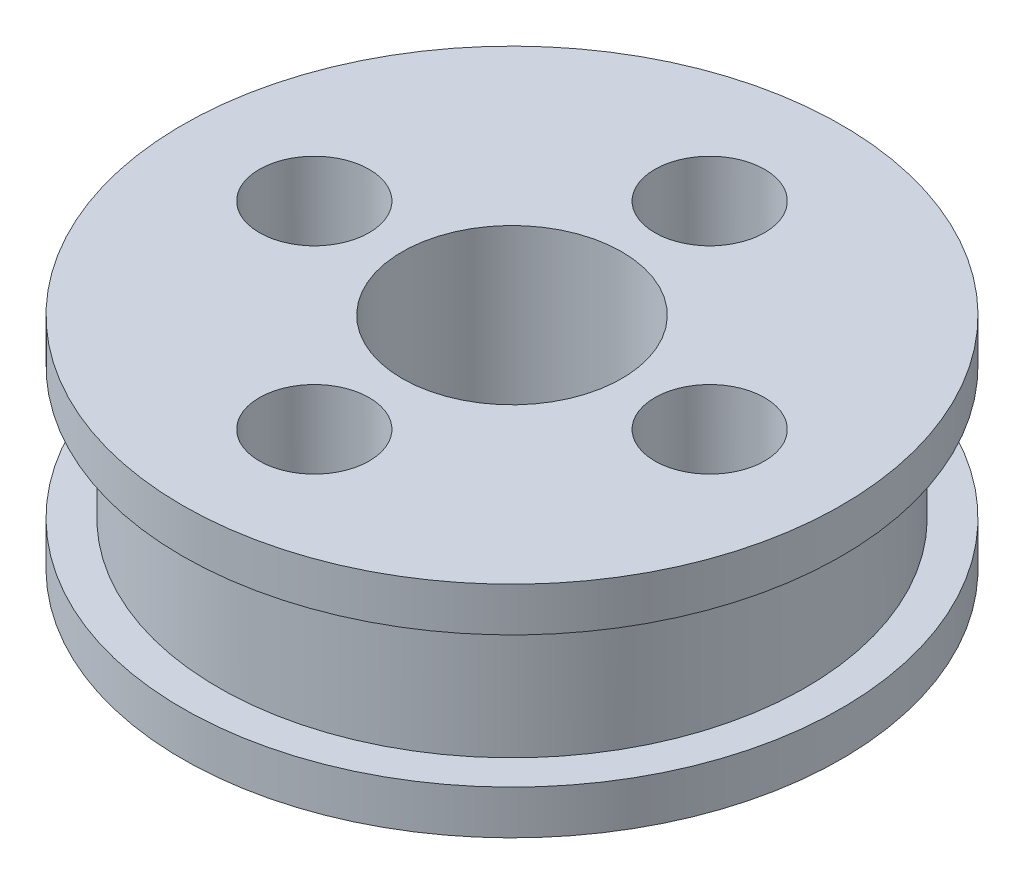
ISO-10303-21;
HEADER;
FILE_DESCRIPTION(('STEP AP214'),'2;1');
FILE_NAME('part.step','',(''),(''),'','','');
FILE_SCHEMA(('AUTOMOTIVE_DESIGN { 1 0 10303 214 1 1 1 1 }'));
ENDSEC;
DATA;
#1=APPLICATION_CONTEXT('core data for automotive mechanical design processes');
#2=APPLICATION_PROTOCOL_DEFINITION('international standard','automotive_design',2000,#1);
#3=PRODUCT_CONTEXT('',#1,'mechanical');
#4=PRODUCT('Part','Part','',(#3));
#5=PRODUCT_RELATED_PRODUCT_CATEGORY('part','',(#4));
#6=PRODUCT_DEFINITION_FORMATION('','',#4);
#7=PRODUCT_DEFINITION_CONTEXT('part definition',#1,'design');
#8=PRODUCT_DEFINITION('design','',#6,#7);
#9=PRODUCT_DEFINITION_SHAPE('','',#8);
#10=(LENGTH_UNIT() NAMED_UNIT(*) SI_UNIT(.MILLI.,.METRE.));
#11=(NAMED_UNIT(*) PLANE_ANGLE_UNIT() SI_UNIT($,.RADIAN.));
#12=(NAMED_UNIT(*) SI_UNIT($,.STERADIAN.) SOLID_ANGLE_UNIT());
#13=UNCERTAINTY_MEASURE_WITH_UNIT(LENGTH_MEASURE(1.E-05),#10,'distance_accuracy_value','');
#14=(GEOMETRIC_REPRESENTATION_CONTEXT(3) GLOBAL_UNCERTAINTY_ASSIGNED_CONTEXT((#13)) GLOBAL_UNIT_ASSIGNED_CONTEXT((#10,
#11,#12)) REPRESENTATION_CONTEXT('',''));
#15=CARTESIAN_POINT('',(0.,0.,0.));
#16=DIRECTION('',(0.,0.,1.));
#17=DIRECTION('',(1.,0.,0.));
#18=AXIS2_PLACEMENT_3D('',#15,#16,#17);
#19=CARTESIAN_POINT('',(0.,10.,0.));
#20=DIRECTION('',(0.,-1.,0.));
#21=DIRECTION('',(0.,0.,-1.));
#22=AXIS2_PLACEMENT_3D('',#19,#20,#21);
#23=CYLINDRICAL_SURFACE('',#22,13.365);
#24=CARTESIAN_POINT('',(0.,8.,0.));
#25=DIRECTION('',(0.,1.,0.));
#26=DIRECTION('',(0.,0.,1.));
#27=AXIS2_PLACEMENT_3D('',#24,#25,#26);
#28=CIRCLE('',#27,13.365);
#29=CARTESIAN_POINT('',(0.,8.,13.365));
#30=VERTEX_POINT('',#29);
#31=EDGE_CURVE('E39',#30,#30,#28,.T.);
#32=ORIENTED_EDGE('',*,*,#31,.F.);
#33=EDGE_LOOP('',(#32));
#34=FACE_BOUND('',#33,.T.);
#35=CARTESIAN_POINT('',(0.,2.,0.));
#36=DIRECTION('',(0.,-1.,0.));
#37=DIRECTION('',(0.,0.,-1.));
#38=AXIS2_PLACEMENT_3D('',#35,#36,#37);
#39=CIRCLE('',#38,13.365);
#40=CARTESIAN_POINT('',(0.,2.,-13.365));
#41=VERTEX_POINT('',#40);
#42=EDGE_CURVE('E10',#41,#41,#39,.T.);
#43=ORIENTED_EDGE('',*,*,#42,.F.);
#44=EDGE_LOOP('',(#43));
#45=FACE_BOUND('',#44,.T.);
#46=ADVANCED_FACE('F32',(#34,#45),#23,.T.);
#47=CARTESIAN_POINT('',(0.,8.,0.));
#48=DIRECTION('',(0.,1.,0.));
#49=DIRECTION('',(0.,0.,1.));
#50=AXIS2_PLACEMENT_3D('',#47,#48,#49);
#51=CYLINDRICAL_SURFACE('',#50,15.);
#52=CARTESIAN_POINT('',(0.,8.,0.));
#53=DIRECTION('',(0.,1.,0.));
#54=DIRECTION('',(0.,0.,1.));
#55=AXIS2_PLACEMENT_3D('',#52,#53,#54);
#56=CIRCLE('',#55,15.);
#57=CARTESIAN_POINT('',(0.,8.,15.));
#58=VERTEX_POINT('',#57);
#59=EDGE_CURVE('E44',#58,#58,#56,.T.);
#60=ORIENTED_EDGE('',*,*,#59,.T.);
#61=EDGE_LOOP('',(#60));
#62=FACE_BOUND('',#61,.T.);
#63=CARTESIAN_POINT('',(0.,10.,0.));
#64=DIRECTION('',(0.,1.,0.));
#65=DIRECTION('',(0.,0.,1.));
#66=AXIS2_PLACEMENT_3D('',#63,#64,#65);
#67=CIRCLE('',#66,15.);
#68=CARTESIAN_POINT('',(0.,10.,15.));
#69=VERTEX_POINT('',#68);
#70=EDGE_CURVE('E71',#69,#69,#67,.T.);
#71=ORIENTED_EDGE('',*,*,#70,.F.);
#72=EDGE_LOOP('',(#71));
#73=FACE_BOUND('',#72,.T.);
#74=ADVANCED_FACE('F81',(#62,#73),#51,.T.);
#75=CARTESIAN_POINT('',(0.,8.,0.));
#76=DIRECTION('',(0.,1.,0.));
#77=DIRECTION('',(0.,0.,1.));
#78=AXIS2_PLACEMENT_3D('',#75,#76,#77);
#79=PLANE('',#78);
#80=ORIENTED_EDGE('',*,*,#31,.T.);
#81=EDGE_LOOP('',(#80));
#82=FACE_BOUND('',#81,.T.);
#83=ORIENTED_EDGE('',*,*,#59,.F.);
#84=EDGE_LOOP('',(#83));
#85=FACE_BOUND('',#84,.T.);
#86=ADVANCED_FACE('F83',(#82,#85),#79,.F.);
#87=CARTESIAN_POINT('',(0.,10.,0.));
#88=DIRECTION('',(0.,1.,0.));
#89=DIRECTION('',(0.,0.,1.));
#90=AXIS2_PLACEMENT_3D('',#87,#88,#89);
#91=PLANE('',#90);
#92=CARTESIAN_POINT('',(0.,10.,9.));
#93=DIRECTION('',(0.,-1.,0.));
#94=DIRECTION('',(0.,0.,-1.));
#95=AXIS2_PLACEMENT_3D('',#92,#93,#94);
#96=CIRCLE('',#95,2.5);
#97=CARTESIAN_POINT('',(0.,10.,6.5));
#98=VERTEX_POINT('',#97);
#99=EDGE_CURVE('E52',#98,#98,#96,.T.);
#100=ORIENTED_EDGE('',*,*,#99,.T.);
#101=EDGE_LOOP('',(#100));
#102=FACE_BOUND('',#101,.T.);
#103=CARTESIAN_POINT('',(0.,10.,0.));
#104=DIRECTION('',(0.,-1.,0.));
#105=DIRECTION('',(0.,0.,-1.));
#106=AXIS2_PLACEMENT_3D('',#103,#104,#105);
#107=CIRCLE('',#106,5.);
#108=CARTESIAN_POINT('',(0.,10.,-5.));
#109=VERTEX_POINT('',#108);
#110=EDGE_CURVE('E207',#109,#109,#107,.T.);
#111=ORIENTED_EDGE('',*,*,#110,.T.);
#112=EDGE_LOOP('',(#111));
#113=FACE_BOUND('',#112,.T.);
#114=CARTESIAN_POINT('',(9.00000000000025,10.,2.54142111694787E-13));
#115=DIRECTION('',(0.,-1.,0.));
#116=DIRECTION('',(0.,0.,-1.));
#117=AXIS2_PLACEMENT_3D('',#114,#115,#116);
#118=CIRCLE('',#117,2.5000000000002);
#119=CARTESIAN_POINT('',(9.00000000000025,10.,-2.49999999999995));
#120=VERTEX_POINT('',#119);
#121=EDGE_CURVE('E204',#120,#120,#118,.T.);
#122=ORIENTED_EDGE('',*,*,#121,.T.);
#123=EDGE_LOOP('',(#122));
#124=FACE_BOUND('',#123,.T.);
#125=CARTESIAN_POINT('',(5.08284223389574E-13,10.,-9.));
#126=DIRECTION('',(0.,-1.,0.));
#127=DIRECTION('',(0.,0.,-1.));
#128=AXIS2_PLACEMENT_3D('',#125,#126,#127);
#129=CIRCLE('',#128,2.50000000000055);
#130=CARTESIAN_POINT('',(5.08284223389574E-13,10.,-11.5000000000005));
#131=VERTEX_POINT('',#130);
#132=EDGE_CURVE('E201',#131,#131,#129,.T.);
#133=ORIENTED_EDGE('',*,*,#132,.T.);
#134=EDGE_LOOP('',(#133));
#135=FACE_BOUND('',#134,.T.);
#136=CARTESIAN_POINT('',(-8.99999999999975,10.,-2.5524429381402E-13));
#137=DIRECTION('',(0.,-1.,0.));
#138=DIRECTION('',(0.,0.,-1.));
#139=AXIS2_PLACEMENT_3D('',#136,#137,#138);
#140=CIRCLE('',#139,2.50000000000041);
#141=CARTESIAN_POINT('',(-8.99999999999975,10.,-2.50000000000066));
#142=VERTEX_POINT('',#141);
#143=EDGE_CURVE('E198',#142,#142,#140,.T.);
#144=ORIENTED_EDGE('',*,*,#143,.T.);
#145=EDGE_LOOP('',(#144));
#146=FACE_BOUND('',#145,.T.);
#147=ORIENTED_EDGE('',*,*,#70,.T.);
#148=EDGE_LOOP('',(#147));
#149=FACE_BOUND('',#148,.T.);
#150=ADVANCED_FACE('F79',(#102,#113,#124,#135,#146,#149),#91,.T.);
#151=CARTESIAN_POINT('',(0.,2.,0.));
#152=DIRECTION('',(0.,-1.,0.));
#153=DIRECTION('',(0.,0.,-1.));
#154=AXIS2_PLACEMENT_3D('',#151,#152,#153);
#155=CYLINDRICAL_SURFACE('',#154,15.);
#156=CARTESIAN_POINT('',(0.,2.,0.));
#157=DIRECTION('',(0.,-1.,0.));
#158=DIRECTION('',(0.,0.,-1.));
#159=AXIS2_PLACEMENT_3D('',#156,#157,#158);
#160=CIRCLE('',#159,15.);
#161=CARTESIAN_POINT('',(0.,2.,-15.));
#162=VERTEX_POINT('',#161);
#163=EDGE_CURVE('E66',#162,#162,#160,.T.);
#164=ORIENTED_EDGE('',*,*,#163,.T.);
#165=EDGE_LOOP('',(#164));
#166=FACE_BOUND('',#165,.T.);
#167=CARTESIAN_POINT('',(0.,0.,0.));
#168=DIRECTION('',(0.,-1.,0.));
#169=DIRECTION('',(0.,0.,-1.));
#170=AXIS2_PLACEMENT_3D('',#167,#168,#169);
#171=CIRCLE('',#170,15.);
#172=CARTESIAN_POINT('',(0.,0.,-15.));
#173=VERTEX_POINT('',#172);
#174=EDGE_CURVE('E62',#173,#173,#171,.T.);
#175=ORIENTED_EDGE('',*,*,#174,.F.);
#176=EDGE_LOOP('',(#175));
#177=FACE_BOUND('',#176,.T.);
#178=ADVANCED_FACE('F96',(#166,#177),#155,.T.);
#179=CARTESIAN_POINT('',(0.,2.,0.));
#180=DIRECTION('',(0.,-1.,0.));
#181=DIRECTION('',(0.,0.,-1.));
#182=AXIS2_PLACEMENT_3D('',#179,#180,#181);
#183=PLANE('',#182);
#184=ORIENTED_EDGE('',*,*,#42,.T.);
#185=EDGE_LOOP('',(#184));
#186=FACE_BOUND('',#185,.T.);
#187=ORIENTED_EDGE('',*,*,#163,.F.);
#188=EDGE_LOOP('',(#187));
#189=FACE_BOUND('',#188,.T.);
#190=ADVANCED_FACE('F101',(#186,#189),#183,.F.);
#191=CARTESIAN_POINT('',(0.,0.,0.));
#192=DIRECTION('',(0.,1.,0.));
#193=DIRECTION('',(0.,0.,1.));
#194=AXIS2_PLACEMENT_3D('',#191,#192,#193);
#195=PLANE('',#194);
#196=CARTESIAN_POINT('',(0.,0.,9.));
#197=DIRECTION('',(0.,1.,0.));
#198=DIRECTION('',(0.,0.,1.));
#199=AXIS2_PLACEMENT_3D('',#196,#197,#198);
#200=CIRCLE('',#199,2.5);
#201=CARTESIAN_POINT('',(0.,0.,11.5));
#202=VERTEX_POINT('',#201);
#203=EDGE_CURVE('E35',#202,#202,#200,.F.);
#204=ORIENTED_EDGE('',*,*,#203,.F.);
#205=EDGE_LOOP('',(#204));
#206=FACE_BOUND('',#205,.T.);
#207=CARTESIAN_POINT('',(0.,0.,0.));
#208=DIRECTION('',(0.,1.,0.));
#209=DIRECTION('',(0.,0.,1.));
#210=AXIS2_PLACEMENT_3D('',#207,#208,#209);
#211=CIRCLE('',#210,5.);
#212=CARTESIAN_POINT('',(0.,0.,5.));
#213=VERTEX_POINT('',#212);
#214=EDGE_CURVE('E57',#213,#213,#211,.F.);
#215=ORIENTED_EDGE('',*,*,#214,.F.);
#216=EDGE_LOOP('',(#215));
#217=FACE_BOUND('',#216,.T.);
#218=CARTESIAN_POINT('',(9.00000000000025,0.,2.54142111694787E-13));
#219=DIRECTION('',(0.,1.,0.));
#220=DIRECTION('',(0.,0.,1.));
#221=AXIS2_PLACEMENT_3D('',#218,#219,#220);
#222=CIRCLE('',#221,2.5000000000002);
#223=CARTESIAN_POINT('',(9.00000000000025,0.,2.50000000000045));
#224=VERTEX_POINT('',#223);
#225=EDGE_CURVE('E55',#224,#224,#222,.F.);
#226=ORIENTED_EDGE('',*,*,#225,.F.);
#227=EDGE_LOOP('',(#226));
#228=FACE_BOUND('',#227,.T.);
#229=CARTESIAN_POINT('',(5.08284223389574E-13,0.,-9.));
#230=DIRECTION('',(0.,1.,0.));
#231=DIRECTION('',(0.,0.,1.));
#232=AXIS2_PLACEMENT_3D('',#229,#230,#231);
#233=CIRCLE('',#232,2.50000000000055);
#234=CARTESIAN_POINT('',(5.08284223389574E-13,0.,-6.49999999999945));
#235=VERTEX_POINT('',#234);
#236=EDGE_CURVE('E51',#235,#235,#233,.F.);
#237=ORIENTED_EDGE('',*,*,#236,.F.);
#238=EDGE_LOOP('',(#237));
#239=FACE_BOUND('',#238,.T.);
#240=CARTESIAN_POINT('',(-8.99999999999975,0.,-2.5524429381402E-13));
#241=DIRECTION('',(0.,1.,0.));
#242=DIRECTION('',(0.,0.,1.));
#243=AXIS2_PLACEMENT_3D('',#240,#241,#242);
#244=CIRCLE('',#243,2.50000000000041);
#245=CARTESIAN_POINT('',(-8.99999999999975,0.,2.50000000000015));
#246=VERTEX_POINT('',#245);
#247=EDGE_CURVE('E48',#246,#246,#244,.F.);
#248=ORIENTED_EDGE('',*,*,#247,.F.);
#249=EDGE_LOOP('',(#248));
#250=FACE_BOUND('',#249,.T.);
#251=ORIENTED_EDGE('',*,*,#174,.T.);
#252=EDGE_LOOP('',(#251));
#253=FACE_BOUND('',#252,.T.);
#254=ADVANCED_FACE('F98',(#206,#217,#228,#239,#250,#253),#195,.F.);
#255=CARTESIAN_POINT('',(-8.99999999999975,-10.,-2.5524429381402E-13));
#256=DIRECTION('',(0.,1.,0.));
#257=DIRECTION('',(0.,0.,1.));
#258=AXIS2_PLACEMENT_3D('',#255,#256,#257);
#259=CYLINDRICAL_SURFACE('',#258,2.50000000000041);
#260=ORIENTED_EDGE('',*,*,#143,.F.);
#261=EDGE_LOOP('',(#260));
#262=FACE_BOUND('',#261,.T.);
#263=ORIENTED_EDGE('',*,*,#247,.T.);
#264=EDGE_LOOP('',(#263));
#265=FACE_BOUND('',#264,.T.);
#266=ADVANCED_FACE('F100',(#262,#265),#259,.F.);
#267=CARTESIAN_POINT('',(5.08284223389574E-13,-10.,-9.));
#268=DIRECTION('',(0.,1.,0.));
#269=DIRECTION('',(0.,0.,1.));
#270=AXIS2_PLACEMENT_3D('',#267,#268,#269);
#271=CYLINDRICAL_SURFACE('',#270,2.50000000000055);
#272=ORIENTED_EDGE('',*,*,#132,.F.);
#273=EDGE_LOOP('',(#272));
#274=FACE_BOUND('',#273,.T.);
#275=ORIENTED_EDGE('',*,*,#236,.T.);
#276=EDGE_LOOP('',(#275));
#277=FACE_BOUND('',#276,.T.);
#278=ADVANCED_FACE('F107',(#274,#277),#271,.F.);
#279=CARTESIAN_POINT('',(9.00000000000025,-10.,2.54142111694787E-13));
#280=DIRECTION('',(0.,1.,0.));
#281=DIRECTION('',(0.,0.,1.));
#282=AXIS2_PLACEMENT_3D('',#279,#280,#281);
#283=CYLINDRICAL_SURFACE('',#282,2.5000000000002);
#284=ORIENTED_EDGE('',*,*,#121,.F.);
#285=EDGE_LOOP('',(#284));
#286=FACE_BOUND('',#285,.T.);
#287=ORIENTED_EDGE('',*,*,#225,.T.);
#288=EDGE_LOOP('',(#287));
#289=FACE_BOUND('',#288,.T.);
#290=ADVANCED_FACE('F121',(#286,#289),#283,.F.);
#291=CARTESIAN_POINT('',(0.,-10.,0.));
#292=DIRECTION('',(0.,1.,0.));
#293=DIRECTION('',(0.,0.,1.));
#294=AXIS2_PLACEMENT_3D('',#291,#292,#293);
#295=CYLINDRICAL_SURFACE('',#294,5.);
#296=ORIENTED_EDGE('',*,*,#110,.F.);
#297=EDGE_LOOP('',(#296));
#298=FACE_BOUND('',#297,.T.);
#299=ORIENTED_EDGE('',*,*,#214,.T.);
#300=EDGE_LOOP('',(#299));
#301=FACE_BOUND('',#300,.T.);
#302=ADVANCED_FACE('F127',(#298,#301),#295,.F.);
#303=CARTESIAN_POINT('',(0.,-10.,9.));
#304=DIRECTION('',(0.,1.,0.));
#305=DIRECTION('',(0.,0.,1.));
#306=AXIS2_PLACEMENT_3D('',#303,#304,#305);
#307=CYLINDRICAL_SURFACE('',#306,2.5);
#308=ORIENTED_EDGE('',*,*,#99,.F.);
#309=EDGE_LOOP('',(#308));
#310=FACE_BOUND('',#309,.T.);
#311=ORIENTED_EDGE('',*,*,#203,.T.);
#312=EDGE_LOOP('',(#311));
#313=FACE_BOUND('',#312,.T.);
#314=ADVANCED_FACE('F183',(#310,#313),#307,.F.);
#315=CLOSED_SHELL('',(#46,#74,#86,#150,#178,#190,#254,#266,#278,#290,#302,#314));
#316=MANIFOLD_SOLID_BREP('B2',#315);
#317=ADVANCED_BREP_SHAPE_REPRESENTATION('',(#18,#316),#14);
#318=SHAPE_DEFINITION_REPRESENTATION(#9,#317);
ENDSEC;
END-ISO-10303-21;
